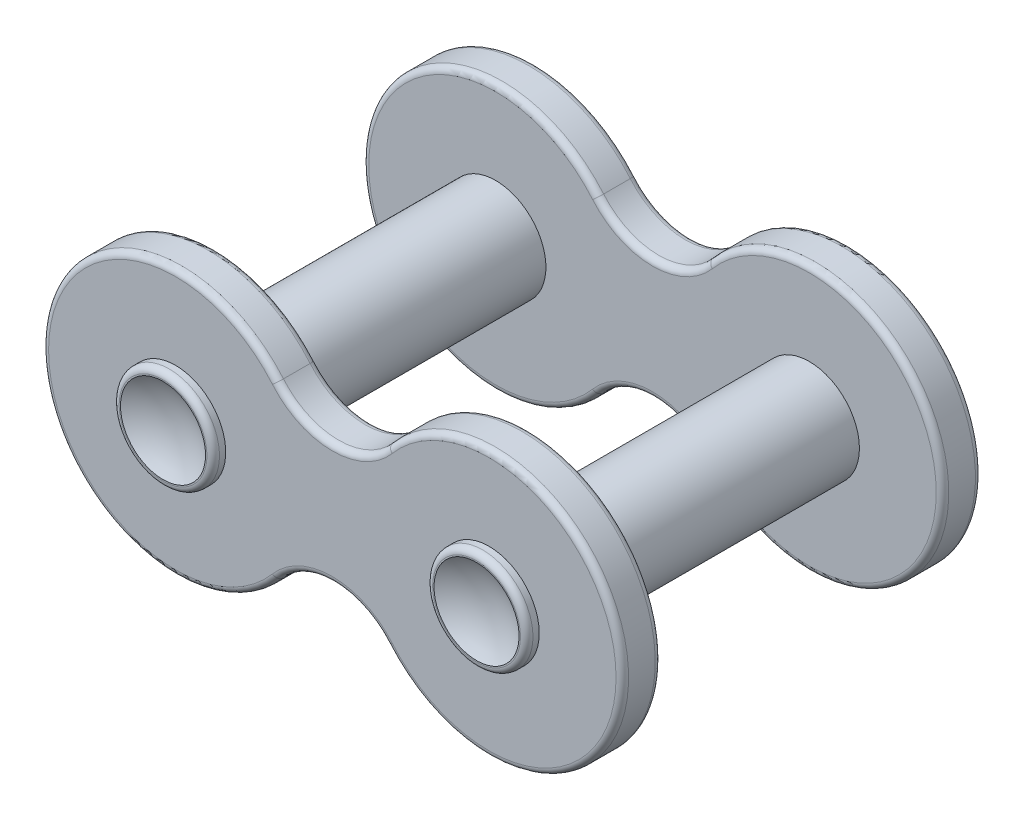
ISO-10303-21;
HEADER;
FILE_DESCRIPTION(('STEP AP214'),'2;1');
FILE_NAME('part.step','',(''),(''),'','','');
FILE_SCHEMA(('AUTOMOTIVE_DESIGN { 1 0 10303 214 1 1 1 1 }'));
ENDSEC;
DATA;
#1=APPLICATION_CONTEXT('core data for automotive mechanical design processes');
#2=APPLICATION_PROTOCOL_DEFINITION('international standard','automotive_design',2000,#1);
#3=PRODUCT_CONTEXT('',#1,'mechanical');
#4=PRODUCT('Part','Part','',(#3));
#5=PRODUCT_RELATED_PRODUCT_CATEGORY('part','',(#4));
#6=PRODUCT_DEFINITION_FORMATION('','',#4);
#7=PRODUCT_DEFINITION_CONTEXT('part definition',#1,'design');
#8=PRODUCT_DEFINITION('design','',#6,#7);
#9=PRODUCT_DEFINITION_SHAPE('','',#8);
#10=(LENGTH_UNIT() NAMED_UNIT(*) SI_UNIT(.MILLI.,.METRE.));
#11=(NAMED_UNIT(*) PLANE_ANGLE_UNIT() SI_UNIT($,.RADIAN.));
#12=(NAMED_UNIT(*) SI_UNIT($,.STERADIAN.) SOLID_ANGLE_UNIT());
#13=UNCERTAINTY_MEASURE_WITH_UNIT(LENGTH_MEASURE(1.E-05),#10,'distance_accuracy_value','');
#14=(GEOMETRIC_REPRESENTATION_CONTEXT(3) GLOBAL_UNCERTAINTY_ASSIGNED_CONTEXT((#13)) GLOBAL_UNIT_ASSIGNED_CONTEXT((#10,
#11,#12)) REPRESENTATION_CONTEXT('',''));
#15=CARTESIAN_POINT('',(0.,0.,0.));
#16=DIRECTION('',(0.,0.,1.));
#17=DIRECTION('',(1.,0.,0.));
#18=AXIS2_PLACEMENT_3D('',#15,#16,#17);
#19=CARTESIAN_POINT('',(2.0833335,1.76532114143129,1.04166667));
#20=DIRECTION('',(0.,0.,1.));
#21=DIRECTION('',(1.,0.,0.));
#22=AXIS2_PLACEMENT_3D('',#19,#20,#21);
#23=PLANE('',#22);
#24=CARTESIAN_POINT('',(-4.166667,0.,1.04166667));
#25=DIRECTION('',(0.,0.,1.));
#26=DIRECTION('',(1.,0.,0.));
#27=AXIS2_PLACEMENT_3D('',#24,#25,#26);
#28=CIRCLE('',#27,3.37499983333333);
#29=CARTESIAN_POINT('',(-1.59176297349593,2.18185543272077,1.04166667));
#30=VERTEX_POINT('',#29);
#31=CARTESIAN_POINT('',(-1.59176297349592,-2.18185543272078,1.04166667));
#32=VERTEX_POINT('',#31);
#33=EDGE_CURVE('E176',#30,#32,#28,.T.);
#34=ORIENTED_EDGE('',*,*,#33,.T.);
#35=CARTESIAN_POINT('',(0.,-3.53064228286257,1.04166667));
#36=DIRECTION('',(0.,0.,1.));
#37=DIRECTION('',(1.,0.,0.));
#38=AXIS2_PLACEMENT_3D('',#35,#36,#37);
#39=CIRCLE('',#38,2.08636893451471);
#40=CARTESIAN_POINT('',(1.59176297349593,-2.18185543272077,1.04166667));
#41=VERTEX_POINT('',#40);
#42=EDGE_CURVE('E158',#32,#41,#39,.F.);
#43=ORIENTED_EDGE('',*,*,#42,.T.);
#44=CARTESIAN_POINT('',(4.166667,0.,1.04166667));
#45=DIRECTION('',(0.,0.,1.));
#46=DIRECTION('',(1.,0.,0.));
#47=AXIS2_PLACEMENT_3D('',#44,#45,#46);
#48=CIRCLE('',#47,3.37499983333333);
#49=CARTESIAN_POINT('',(1.59176297349593,2.18185543272077,1.04166667));
#50=VERTEX_POINT('',#49);
#51=EDGE_CURVE('E170',#41,#50,#48,.T.);
#52=ORIENTED_EDGE('',*,*,#51,.T.);
#53=CARTESIAN_POINT('',(0.,3.53064228286257,1.04166667));
#54=DIRECTION('',(0.,0.,1.));
#55=DIRECTION('',(1.,0.,0.));
#56=AXIS2_PLACEMENT_3D('',#53,#54,#55);
#57=CIRCLE('',#56,2.08636893451471);
#58=EDGE_CURVE('E175',#50,#30,#57,.F.);
#59=ORIENTED_EDGE('',*,*,#58,.T.);
#60=EDGE_LOOP('',(#34,#43,#52,#59));
#61=FACE_BOUND('',#60,.T.);
#62=CARTESIAN_POINT('',(4.166667,0.,1.04166667));
#63=DIRECTION('',(0.,0.,1.));
#64=DIRECTION('',(1.,0.,0.));
#65=AXIS2_PLACEMENT_3D('',#62,#63,#64);
#66=CIRCLE('',#65,1.333335);
#67=CARTESIAN_POINT('',(5.500002,0.,1.04166667));
#68=VERTEX_POINT('',#67);
#69=EDGE_CURVE('E304',#68,#68,#66,.T.);
#70=ORIENTED_EDGE('',*,*,#69,.F.);
#71=EDGE_LOOP('',(#70));
#72=FACE_BOUND('',#71,.T.);
#73=CARTESIAN_POINT('',(-4.166667,0.,1.04166667));
#74=DIRECTION('',(0.,0.,1.));
#75=DIRECTION('',(-1.,0.,0.));
#76=AXIS2_PLACEMENT_3D('',#73,#74,#75);
#77=CIRCLE('',#76,1.333335);
#78=CARTESIAN_POINT('',(-5.500002,0.,1.04166667));
#79=VERTEX_POINT('',#78);
#80=EDGE_CURVE('E296',#79,#79,#77,.T.);
#81=ORIENTED_EDGE('',*,*,#80,.F.);
#82=EDGE_LOOP('',(#81));
#83=FACE_BOUND('',#82,.T.);
#84=ADVANCED_FACE('F39',(#61,#72,#83),#23,.T.);
#85=CARTESIAN_POINT('',(2.0833335,1.76532114143129,0.));
#86=DIRECTION('',(0.,0.,1.));
#87=DIRECTION('',(1.,0.,0.));
#88=AXIS2_PLACEMENT_3D('',#85,#86,#87);
#89=PLANE('',#88);
#90=CARTESIAN_POINT('',(4.166667,0.,0.));
#91=DIRECTION('',(0.,0.,1.));
#92=DIRECTION('',(1.,0.,0.));
#93=AXIS2_PLACEMENT_3D('',#90,#91,#92);
#94=CIRCLE('',#93,3.37499983333333);
#95=CARTESIAN_POINT('',(1.59176297349593,2.18185543272077,0.));
#96=VERTEX_POINT('',#95);
#97=CARTESIAN_POINT('',(1.59176297349593,-2.18185543272077,0.));
#98=VERTEX_POINT('',#97);
#99=EDGE_CURVE('E198',#96,#98,#94,.F.);
#100=ORIENTED_EDGE('',*,*,#99,.T.);
#101=CARTESIAN_POINT('',(0.,-3.53064228286257,0.));
#102=DIRECTION('',(0.,0.,1.));
#103=DIRECTION('',(1.,0.,0.));
#104=AXIS2_PLACEMENT_3D('',#101,#102,#103);
#105=CIRCLE('',#104,2.08636893451471);
#106=CARTESIAN_POINT('',(-1.59176297349592,-2.18185543272078,0.));
#107=VERTEX_POINT('',#106);
#108=EDGE_CURVE('E205',#98,#107,#105,.T.);
#109=ORIENTED_EDGE('',*,*,#108,.T.);
#110=CARTESIAN_POINT('',(-4.166667,0.,0.));
#111=DIRECTION('',(0.,0.,1.));
#112=DIRECTION('',(1.,0.,0.));
#113=AXIS2_PLACEMENT_3D('',#110,#111,#112);
#114=CIRCLE('',#113,3.37499983333333);
#115=CARTESIAN_POINT('',(-1.59176297349593,2.18185543272077,0.));
#116=VERTEX_POINT('',#115);
#117=EDGE_CURVE('E199',#107,#116,#114,.F.);
#118=ORIENTED_EDGE('',*,*,#117,.T.);
#119=CARTESIAN_POINT('',(0.,3.53064228286257,0.));
#120=DIRECTION('',(0.,0.,1.));
#121=DIRECTION('',(1.,0.,0.));
#122=AXIS2_PLACEMENT_3D('',#119,#120,#121);
#123=CIRCLE('',#122,2.08636893451471);
#124=EDGE_CURVE('E196',#116,#96,#123,.T.);
#125=ORIENTED_EDGE('',*,*,#124,.T.);
#126=EDGE_LOOP('',(#100,#109,#118,#125));
#127=FACE_BOUND('',#126,.T.);
#128=CARTESIAN_POINT('',(4.166667,0.,0.));
#129=DIRECTION('',(0.,0.,1.));
#130=DIRECTION('',(1.,0.,0.));
#131=AXIS2_PLACEMENT_3D('',#128,#129,#130);
#132=CIRCLE('',#131,1.333335);
#133=CARTESIAN_POINT('',(5.500002,0.,0.));
#134=VERTEX_POINT('',#133);
#135=EDGE_CURVE('E327',#134,#134,#132,.T.);
#136=ORIENTED_EDGE('',*,*,#135,.T.);
#137=EDGE_LOOP('',(#136));
#138=FACE_BOUND('',#137,.T.);
#139=CARTESIAN_POINT('',(-4.166667,0.,0.));
#140=DIRECTION('',(0.,0.,1.));
#141=DIRECTION('',(1.,0.,0.));
#142=AXIS2_PLACEMENT_3D('',#139,#140,#141);
#143=CIRCLE('',#142,1.333335);
#144=CARTESIAN_POINT('',(-2.833332,0.,0.));
#145=VERTEX_POINT('',#144);
#146=EDGE_CURVE('E291',#145,#145,#143,.F.);
#147=ORIENTED_EDGE('',*,*,#146,.F.);
#148=EDGE_LOOP('',(#147));
#149=FACE_BOUND('',#148,.T.);
#150=ADVANCED_FACE('F397',(#127,#138,#149),#89,.F.);
#151=CARTESIAN_POINT('',(0.,3.53064228286257,1.04166667));
#152=DIRECTION('',(0.,0.,-1.));
#153=DIRECTION('',(-1.,0.,0.));
#154=AXIS2_PLACEMENT_3D('',#151,#152,#153);
#155=CYLINDRICAL_SURFACE('',#154,1.91970226784804);
#156=DIRECTION('',(0.,0.,-1.));
#157=VECTOR('',#156,1.);
#158=CARTESIAN_POINT('',(-1.46460721282138,2.2896013853364,1.04166667));
#159=LINE('',#158,#157);
#160=CARTESIAN_POINT('',(-1.46460721282138,2.2896013853364,0.875000003333333));
#161=VERTEX_POINT('',#160);
#162=CARTESIAN_POINT('',(-1.46460721282138,2.2896013853364,0.166666666666667));
#163=VERTEX_POINT('',#162);
#164=EDGE_CURVE('E320',#161,#163,#159,.T.);
#165=ORIENTED_EDGE('',*,*,#164,.F.);
#166=CARTESIAN_POINT('',(0.,3.53064228286257,0.875000003333333));
#167=DIRECTION('',(0.,0.,1.));
#168=DIRECTION('',(1.,0.,0.));
#169=AXIS2_PLACEMENT_3D('',#166,#167,#168);
#170=CIRCLE('',#169,1.91970226784804);
#171=CARTESIAN_POINT('',(1.46460721282137,2.28960138533641,0.875000003333333));
#172=VERTEX_POINT('',#171);
#173=EDGE_CURVE('E192',#161,#172,#170,.T.);
#174=ORIENTED_EDGE('',*,*,#173,.T.);
#175=DIRECTION('',(0.,0.,-1.));
#176=VECTOR('',#175,1.);
#177=CARTESIAN_POINT('',(1.46460721282137,2.28960138533641,1.04166667));
#178=LINE('',#177,#176);
#179=CARTESIAN_POINT('',(1.46460721282137,2.28960138533641,0.166666666666667));
#180=VERTEX_POINT('',#179);
#181=EDGE_CURVE('E306',#172,#180,#178,.T.);
#182=ORIENTED_EDGE('',*,*,#181,.T.);
#183=CARTESIAN_POINT('',(0.,3.53064228286257,0.166666666666667));
#184=DIRECTION('',(0.,0.,1.));
#185=DIRECTION('',(1.,0.,0.));
#186=AXIS2_PLACEMENT_3D('',#183,#184,#185);
#187=CIRCLE('',#186,1.91970226784804);
#188=EDGE_CURVE('E195',#180,#163,#187,.F.);
#189=ORIENTED_EDGE('',*,*,#188,.T.);
#190=EDGE_LOOP('',(#165,#174,#182,#189));
#191=FACE_BOUND('',#190,.T.);
#192=ADVANCED_FACE('F388',(#191),#155,.F.);
#193=CARTESIAN_POINT('',(-4.166667,0.,1.04166667));
#194=DIRECTION('',(0.,0.,-1.));
#195=DIRECTION('',(-1.,0.,0.));
#196=AXIS2_PLACEMENT_3D('',#193,#194,#195);
#197=CYLINDRICAL_SURFACE('',#196,3.5416665);
#198=DIRECTION('',(0.,0.,-1.));
#199=VECTOR('',#198,1.);
#200=CARTESIAN_POINT('',(-1.46460721282136,-2.28960138533642,1.04166667));
#201=LINE('',#200,#199);
#202=CARTESIAN_POINT('',(-1.46460721282136,-2.28960138533642,0.875000003333333));
#203=VERTEX_POINT('',#202);
#204=CARTESIAN_POINT('',(-1.46460721282136,-2.28960138533642,0.166666666666667));
#205=VERTEX_POINT('',#204);
#206=EDGE_CURVE('E314',#203,#205,#201,.T.);
#207=ORIENTED_EDGE('',*,*,#206,.F.);
#208=CARTESIAN_POINT('',(-4.166667,0.,0.875000003333333));
#209=DIRECTION('',(0.,0.,1.));
#210=DIRECTION('',(1.,0.,0.));
#211=AXIS2_PLACEMENT_3D('',#208,#209,#210);
#212=CIRCLE('',#211,3.5416665);
#213=EDGE_CURVE('E187',#203,#161,#212,.F.);
#214=ORIENTED_EDGE('',*,*,#213,.T.);
#215=ORIENTED_EDGE('',*,*,#164,.T.);
#216=CARTESIAN_POINT('',(-4.166667,0.,0.166666666666667));
#217=DIRECTION('',(0.,0.,1.));
#218=DIRECTION('',(1.,0.,0.));
#219=AXIS2_PLACEMENT_3D('',#216,#217,#218);
#220=CIRCLE('',#219,3.5416665);
#221=EDGE_CURVE('E190',#163,#205,#220,.T.);
#222=ORIENTED_EDGE('',*,*,#221,.T.);
#223=EDGE_LOOP('',(#207,#214,#215,#222));
#224=FACE_BOUND('',#223,.T.);
#225=ADVANCED_FACE('F373',(#224),#197,.T.);
#226=CARTESIAN_POINT('',(0.,-3.53064228286257,1.04166667));
#227=DIRECTION('',(0.,0.,-1.));
#228=DIRECTION('',(-1.,0.,0.));
#229=AXIS2_PLACEMENT_3D('',#226,#227,#228);
#230=CYLINDRICAL_SURFACE('',#229,1.91970226784804);
#231=DIRECTION('',(0.,0.,-1.));
#232=VECTOR('',#231,1.);
#233=CARTESIAN_POINT('',(1.46460721282137,-2.28960138533641,1.04166667));
#234=LINE('',#233,#232);
#235=CARTESIAN_POINT('',(1.46460721282137,-2.28960138533641,0.875000003333333));
#236=VERTEX_POINT('',#235);
#237=CARTESIAN_POINT('',(1.46460721282137,-2.28960138533641,0.166666666666667));
#238=VERTEX_POINT('',#237);
#239=EDGE_CURVE('E313',#236,#238,#234,.T.);
#240=ORIENTED_EDGE('',*,*,#239,.F.);
#241=CARTESIAN_POINT('',(0.,-3.53064228286257,0.875000003333333));
#242=DIRECTION('',(0.,0.,1.));
#243=DIRECTION('',(1.,0.,0.));
#244=AXIS2_PLACEMENT_3D('',#241,#242,#243);
#245=CIRCLE('',#244,1.91970226784804);
#246=EDGE_CURVE('E159',#236,#203,#245,.T.);
#247=ORIENTED_EDGE('',*,*,#246,.T.);
#248=ORIENTED_EDGE('',*,*,#206,.T.);
#249=CARTESIAN_POINT('',(0.,-3.53064228286257,0.166666666666667));
#250=DIRECTION('',(0.,0.,1.));
#251=DIRECTION('',(1.,0.,0.));
#252=AXIS2_PLACEMENT_3D('',#249,#250,#251);
#253=CIRCLE('',#252,1.91970226784804);
#254=EDGE_CURVE('E179',#205,#238,#253,.F.);
#255=ORIENTED_EDGE('',*,*,#254,.T.);
#256=EDGE_LOOP('',(#240,#247,#248,#255));
#257=FACE_BOUND('',#256,.T.);
#258=ADVANCED_FACE('F371',(#257),#230,.F.);
#259=CARTESIAN_POINT('',(4.166667,0.,1.04166667));
#260=DIRECTION('',(0.,0.,-1.));
#261=DIRECTION('',(-1.,0.,0.));
#262=AXIS2_PLACEMENT_3D('',#259,#260,#261);
#263=CYLINDRICAL_SURFACE('',#262,3.5416665);
#264=ORIENTED_EDGE('',*,*,#181,.F.);
#265=CARTESIAN_POINT('',(4.166667,0.,0.875000003333333));
#266=DIRECTION('',(0.,0.,1.));
#267=DIRECTION('',(1.,0.,0.));
#268=AXIS2_PLACEMENT_3D('',#265,#266,#267);
#269=CIRCLE('',#268,3.5416665);
#270=EDGE_CURVE('E237',#172,#236,#269,.F.);
#271=ORIENTED_EDGE('',*,*,#270,.T.);
#272=ORIENTED_EDGE('',*,*,#239,.T.);
#273=CARTESIAN_POINT('',(4.166667,0.,0.166666666666667));
#274=DIRECTION('',(0.,0.,1.));
#275=DIRECTION('',(1.,0.,0.));
#276=AXIS2_PLACEMENT_3D('',#273,#274,#275);
#277=CIRCLE('',#276,3.5416665);
#278=EDGE_CURVE('E232',#238,#180,#277,.T.);
#279=ORIENTED_EDGE('',*,*,#278,.T.);
#280=EDGE_LOOP('',(#264,#271,#272,#279));
#281=FACE_BOUND('',#280,.T.);
#282=ADVANCED_FACE('F390',(#281),#263,.T.);
#283=CARTESIAN_POINT('',(-4.166667,0.,-0.33333333));
#284=DIRECTION('',(0.,0.,-1.));
#285=DIRECTION('',(-1.,0.,0.));
#286=AXIS2_PLACEMENT_3D('',#283,#284,#285);
#287=PLANE('',#286);
#288=CARTESIAN_POINT('',(-4.166667,0.,-0.33333333));
#289=DIRECTION('',(0.,0.,-1.));
#290=DIRECTION('',(-1.,0.,0.));
#291=AXIS2_PLACEMENT_3D('',#288,#289,#290);
#292=CIRCLE('',#291,1.16666833333334);
#293=CARTESIAN_POINT('',(-5.33333533333334,0.,-0.33333333));
#294=VERTEX_POINT('',#293);
#295=EDGE_CURVE('E323',#294,#294,#292,.T.);
#296=ORIENTED_EDGE('',*,*,#295,.T.);
#297=EDGE_LOOP('',(#296));
#298=FACE_BOUND('',#297,.T.);
#299=CARTESIAN_POINT('',(-4.166667,0.,-0.33333333));
#300=DIRECTION('',(0.,0.,-1.));
#301=DIRECTION('',(-1.,0.,0.));
#302=AXIS2_PLACEMENT_3D('',#299,#300,#301);
#303=CIRCLE('',#302,1.13038822706577);
#304=CARTESIAN_POINT('',(-5.29705522706577,0.,-0.33333333));
#305=VERTEX_POINT('',#304);
#306=EDGE_CURVE('E334',#305,#305,#303,.T.);
#307=ORIENTED_EDGE('',*,*,#306,.F.);
#308=EDGE_LOOP('',(#307));
#309=FACE_BOUND('',#308,.T.);
#310=ADVANCED_FACE('F413',(#298,#309),#287,.T.);
#311=CARTESIAN_POINT('',(-4.166667,0.,-0.33333333));
#312=DIRECTION('',(0.,0.,1.));
#313=DIRECTION('',(1.,0.,0.));
#314=AXIS2_PLACEMENT_3D('',#311,#312,#313);
#315=CYLINDRICAL_SURFACE('',#314,1.333335);
#316=CARTESIAN_POINT('',(-4.166667,0.,-0.166666663333333));
#317=DIRECTION('',(0.,0.,-1.));
#318=DIRECTION('',(-1.,0.,0.));
#319=AXIS2_PLACEMENT_3D('',#316,#317,#318);
#320=CIRCLE('',#319,1.333335);
#321=CARTESIAN_POINT('',(-5.500002,0.,-0.166666663333333));
#322=VERTEX_POINT('',#321);
#323=EDGE_CURVE('E337',#322,#322,#320,.F.);
#324=ORIENTED_EDGE('',*,*,#323,.T.);
#325=EDGE_LOOP('',(#324));
#326=FACE_BOUND('',#325,.T.);
#327=ORIENTED_EDGE('',*,*,#146,.T.);
#328=EDGE_LOOP('',(#327));
#329=FACE_BOUND('',#328,.T.);
#330=ADVANCED_FACE('F410',(#326,#329),#315,.T.);
#331=CARTESIAN_POINT('',(-4.166667,0.,8.51033333));
#332=DIRECTION('',(0.,0.,1.));
#333=DIRECTION('',(-1.,0.,0.));
#334=AXIS2_PLACEMENT_3D('',#331,#332,#333);
#335=CIRCLE('',#334,1.333335);
#336=CARTESIAN_POINT('',(-5.500002,0.,8.51033333));
#337=VERTEX_POINT('',#336);
#338=EDGE_CURVE('E330',#337,#337,#335,.T.);
#339=ORIENTED_EDGE('',*,*,#338,.F.);
#340=EDGE_LOOP('',(#339));
#341=FACE_BOUND('',#340,.T.);
#342=ORIENTED_EDGE('',*,*,#80,.T.);
#343=EDGE_LOOP('',(#342));
#344=FACE_BOUND('',#343,.T.);
#345=ADVANCED_FACE('F407',(#341,#344),#315,.T.);
#346=CARTESIAN_POINT('',(0.,3.53064228286257,8.51033333));
#347=DIRECTION('',(0.,0.,1.));
#348=DIRECTION('',(1.,0.,0.));
#349=AXIS2_PLACEMENT_3D('',#346,#347,#348);
#350=CYLINDRICAL_SURFACE('',#349,1.91970226784804);
#351=DIRECTION('',(0.,0.,1.));
#352=VECTOR('',#351,1.);
#353=CARTESIAN_POINT('',(1.46460721282137,2.28960138533641,8.51033333));
#354=LINE('',#353,#352);
#355=CARTESIAN_POINT('',(1.46460721282137,2.28960138533641,8.67699999666667));
#356=VERTEX_POINT('',#355);
#357=CARTESIAN_POINT('',(1.46460721282137,2.28960138533641,9.38533333333333));
#358=VERTEX_POINT('',#357);
#359=EDGE_CURVE('E283',#356,#358,#354,.T.);
#360=ORIENTED_EDGE('',*,*,#359,.F.);
#361=CARTESIAN_POINT('',(0.,3.53064228286257,8.67699999666667));
#362=DIRECTION('',(0.,0.,-1.));
#363=DIRECTION('',(-1.,0.,0.));
#364=AXIS2_PLACEMENT_3D('',#361,#362,#363);
#365=CIRCLE('',#364,1.91970226784804);
#366=CARTESIAN_POINT('',(-1.46460721282138,2.2896013853364,8.67699999666667));
#367=VERTEX_POINT('',#366);
#368=EDGE_CURVE('E229',#356,#367,#365,.T.);
#369=ORIENTED_EDGE('',*,*,#368,.T.);
#370=DIRECTION('',(0.,0.,1.));
#371=VECTOR('',#370,1.);
#372=CARTESIAN_POINT('',(-1.46460721282138,2.2896013853364,8.51033333));
#373=LINE('',#372,#371);
#374=CARTESIAN_POINT('',(-1.46460721282138,2.2896013853364,9.38533333333333));
#375=VERTEX_POINT('',#374);
#376=EDGE_CURVE('E290',#367,#375,#373,.T.);
#377=ORIENTED_EDGE('',*,*,#376,.T.);
#378=CARTESIAN_POINT('',(0.,3.53064228286257,9.38533333333333));
#379=DIRECTION('',(0.,0.,-1.));
#380=DIRECTION('',(-1.,0.,0.));
#381=AXIS2_PLACEMENT_3D('',#378,#379,#380);
#382=CIRCLE('',#381,1.91970226784804);
#383=EDGE_CURVE('E221',#375,#358,#382,.F.);
#384=ORIENTED_EDGE('',*,*,#383,.T.);
#385=EDGE_LOOP('',(#360,#369,#377,#384));
#386=FACE_BOUND('',#385,.T.);
#387=ADVANCED_FACE('F285',(#386),#350,.F.);
#388=CARTESIAN_POINT('',(4.166667,0.,8.51033333));
#389=DIRECTION('',(0.,0.,1.));
#390=DIRECTION('',(1.,0.,0.));
#391=AXIS2_PLACEMENT_3D('',#388,#389,#390);
#392=CYLINDRICAL_SURFACE('',#391,3.5416665);
#393=DIRECTION('',(0.,0.,1.));
#394=VECTOR('',#393,1.);
#395=CARTESIAN_POINT('',(1.46460721282137,-2.28960138533641,8.51033333));
#396=LINE('',#395,#394);
#397=CARTESIAN_POINT('',(1.46460721282137,-2.28960138533641,8.67699999666667));
#398=VERTEX_POINT('',#397);
#399=CARTESIAN_POINT('',(1.46460721282137,-2.28960138533641,9.38533333333333));
#400=VERTEX_POINT('',#399);
#401=EDGE_CURVE('E294',#398,#400,#396,.T.);
#402=ORIENTED_EDGE('',*,*,#401,.F.);
#403=CARTESIAN_POINT('',(4.166667,0.,8.67699999666667));
#404=DIRECTION('',(0.,0.,-1.));
#405=DIRECTION('',(-1.,0.,0.));
#406=AXIS2_PLACEMENT_3D('',#403,#404,#405);
#407=CIRCLE('',#406,3.5416665);
#408=EDGE_CURVE('E11',#398,#356,#407,.F.);
#409=ORIENTED_EDGE('',*,*,#408,.T.);
#410=ORIENTED_EDGE('',*,*,#359,.T.);
#411=CARTESIAN_POINT('',(4.166667,0.,9.38533333333333));
#412=DIRECTION('',(0.,0.,-1.));
#413=DIRECTION('',(-1.,0.,0.));
#414=AXIS2_PLACEMENT_3D('',#411,#412,#413);
#415=CIRCLE('',#414,3.5416665);
#416=EDGE_CURVE('E48',#358,#400,#415,.T.);
#417=ORIENTED_EDGE('',*,*,#416,.T.);
#418=EDGE_LOOP('',(#402,#409,#410,#417));
#419=FACE_BOUND('',#418,.T.);
#420=ADVANCED_FACE('F289',(#419),#392,.T.);
#421=CARTESIAN_POINT('',(0.,-3.53064228286257,8.51033333));
#422=DIRECTION('',(0.,0.,1.));
#423=DIRECTION('',(1.,0.,0.));
#424=AXIS2_PLACEMENT_3D('',#421,#422,#423);
#425=CYLINDRICAL_SURFACE('',#424,1.91970226784804);
#426=DIRECTION('',(0.,0.,1.));
#427=VECTOR('',#426,1.);
#428=CARTESIAN_POINT('',(-1.46460721282136,-2.28960138533642,8.51033333));
#429=LINE('',#428,#427);
#430=CARTESIAN_POINT('',(-1.46460721282136,-2.28960138533642,8.67699999666667));
#431=VERTEX_POINT('',#430);
#432=CARTESIAN_POINT('',(-1.46460721282136,-2.28960138533642,9.38533333333333));
#433=VERTEX_POINT('',#432);
#434=EDGE_CURVE('E298',#431,#433,#429,.T.);
#435=ORIENTED_EDGE('',*,*,#434,.F.);
#436=CARTESIAN_POINT('',(0.,-3.53064228286257,8.67699999666667));
#437=DIRECTION('',(0.,0.,-1.));
#438=DIRECTION('',(-1.,0.,0.));
#439=AXIS2_PLACEMENT_3D('',#436,#437,#438);
#440=CIRCLE('',#439,1.91970226784804);
#441=EDGE_CURVE('E208',#431,#398,#440,.T.);
#442=ORIENTED_EDGE('',*,*,#441,.T.);
#443=ORIENTED_EDGE('',*,*,#401,.T.);
#444=CARTESIAN_POINT('',(0.,-3.53064228286257,9.38533333333333));
#445=DIRECTION('',(0.,0.,-1.));
#446=DIRECTION('',(-1.,0.,0.));
#447=AXIS2_PLACEMENT_3D('',#444,#445,#446);
#448=CIRCLE('',#447,1.91970226784804);
#449=EDGE_CURVE('E202',#400,#433,#448,.F.);
#450=ORIENTED_EDGE('',*,*,#449,.T.);
#451=EDGE_LOOP('',(#435,#442,#443,#450));
#452=FACE_BOUND('',#451,.T.);
#453=ADVANCED_FACE('F586',(#452),#425,.F.);
#454=CARTESIAN_POINT('',(-4.166667,0.,8.51033333));
#455=DIRECTION('',(0.,0.,1.));
#456=DIRECTION('',(1.,0.,0.));
#457=AXIS2_PLACEMENT_3D('',#454,#455,#456);
#458=CYLINDRICAL_SURFACE('',#457,3.5416665);
#459=ORIENTED_EDGE('',*,*,#376,.F.);
#460=CARTESIAN_POINT('',(-4.166667,0.,8.67699999666667));
#461=DIRECTION('',(0.,0.,-1.));
#462=DIRECTION('',(-1.,0.,0.));
#463=AXIS2_PLACEMENT_3D('',#460,#461,#462);
#464=CIRCLE('',#463,3.5416665);
#465=EDGE_CURVE('E225',#367,#431,#464,.F.);
#466=ORIENTED_EDGE('',*,*,#465,.T.);
#467=ORIENTED_EDGE('',*,*,#434,.T.);
#468=CARTESIAN_POINT('',(-4.166667,0.,9.38533333333333));
#469=DIRECTION('',(0.,0.,-1.));
#470=DIRECTION('',(-1.,0.,0.));
#471=AXIS2_PLACEMENT_3D('',#468,#469,#470);
#472=CIRCLE('',#471,3.5416665);
#473=EDGE_CURVE('E219',#433,#375,#472,.T.);
#474=ORIENTED_EDGE('',*,*,#473,.T.);
#475=EDGE_LOOP('',(#459,#466,#467,#474));
#476=FACE_BOUND('',#475,.T.);
#477=ADVANCED_FACE('F577',(#476),#458,.T.);
#478=CARTESIAN_POINT('',(2.0833335,1.76532114143129,8.51033333));
#479=DIRECTION('',(0.,0.,-1.));
#480=DIRECTION('',(1.,0.,0.));
#481=AXIS2_PLACEMENT_3D('',#478,#479,#480);
#482=PLANE('',#481);
#483=CARTESIAN_POINT('',(4.166667,0.,8.51033333));
#484=DIRECTION('',(0.,0.,-1.));
#485=DIRECTION('',(-1.,0.,0.));
#486=AXIS2_PLACEMENT_3D('',#483,#484,#485);
#487=CIRCLE('',#486,3.37499983333333);
#488=CARTESIAN_POINT('',(1.59176297349593,2.18185543272077,8.51033333));
#489=VERTEX_POINT('',#488);
#490=CARTESIAN_POINT('',(1.59176297349593,-2.18185543272077,8.51033333));
#491=VERTEX_POINT('',#490);
#492=EDGE_CURVE('E211',#489,#491,#487,.T.);
#493=ORIENTED_EDGE('',*,*,#492,.T.);
#494=CARTESIAN_POINT('',(0.,-3.53064228286257,8.51033333));
#495=DIRECTION('',(0.,0.,-1.));
#496=DIRECTION('',(-1.,0.,0.));
#497=AXIS2_PLACEMENT_3D('',#494,#495,#496);
#498=CIRCLE('',#497,2.08636893451471);
#499=CARTESIAN_POINT('',(-1.59176297349592,-2.18185543272078,8.51033333));
#500=VERTEX_POINT('',#499);
#501=EDGE_CURVE('E220',#491,#500,#498,.F.);
#502=ORIENTED_EDGE('',*,*,#501,.T.);
#503=CARTESIAN_POINT('',(-4.166667,0.,8.51033333));
#504=DIRECTION('',(0.,0.,-1.));
#505=DIRECTION('',(-1.,0.,0.));
#506=AXIS2_PLACEMENT_3D('',#503,#504,#505);
#507=CIRCLE('',#506,3.37499983333333);
#508=CARTESIAN_POINT('',(-1.59176297349593,2.18185543272077,8.51033333));
#509=VERTEX_POINT('',#508);
#510=EDGE_CURVE('E214',#500,#509,#507,.T.);
#511=ORIENTED_EDGE('',*,*,#510,.T.);
#512=CARTESIAN_POINT('',(0.,3.53064228286257,8.51033333));
#513=DIRECTION('',(0.,0.,-1.));
#514=DIRECTION('',(-1.,0.,0.));
#515=AXIS2_PLACEMENT_3D('',#512,#513,#514);
#516=CIRCLE('',#515,2.08636893451471);
#517=EDGE_CURVE('E213',#509,#489,#516,.F.);
#518=ORIENTED_EDGE('',*,*,#517,.T.);
#519=EDGE_LOOP('',(#493,#502,#511,#518));
#520=FACE_BOUND('',#519,.T.);
#521=ORIENTED_EDGE('',*,*,#338,.T.);
#522=EDGE_LOOP('',(#521));
#523=FACE_BOUND('',#522,.T.);
#524=CARTESIAN_POINT('',(4.166667,0.,8.51033333));
#525=DIRECTION('',(0.,0.,-1.));
#526=DIRECTION('',(-1.,0.,0.));
#527=AXIS2_PLACEMENT_3D('',#524,#525,#526);
#528=CIRCLE('',#527,1.333335);
#529=CARTESIAN_POINT('',(2.833332,0.,8.51033333));
#530=VERTEX_POINT('',#529);
#531=EDGE_CURVE('E335',#530,#530,#528,.T.);
#532=ORIENTED_EDGE('',*,*,#531,.F.);
#533=EDGE_LOOP('',(#532));
#534=FACE_BOUND('',#533,.T.);
#535=ADVANCED_FACE('F568',(#520,#523,#534),#482,.T.);
#536=CARTESIAN_POINT('',(2.0833335,1.76532114143129,9.552));
#537=DIRECTION('',(0.,0.,-1.));
#538=DIRECTION('',(1.,0.,0.));
#539=AXIS2_PLACEMENT_3D('',#536,#537,#538);
#540=PLANE('',#539);
#541=CARTESIAN_POINT('',(-4.166667,0.,9.552));
#542=DIRECTION('',(0.,0.,-1.));
#543=DIRECTION('',(-1.,0.,0.));
#544=AXIS2_PLACEMENT_3D('',#541,#542,#543);
#545=CIRCLE('',#544,3.37499983333333);
#546=CARTESIAN_POINT('',(-1.59176297349593,2.18185543272077,9.552));
#547=VERTEX_POINT('',#546);
#548=CARTESIAN_POINT('',(-1.59176297349592,-2.18185543272078,9.552));
#549=VERTEX_POINT('',#548);
#550=EDGE_CURVE('E57',#547,#549,#545,.F.);
#551=ORIENTED_EDGE('',*,*,#550,.T.);
#552=CARTESIAN_POINT('',(0.,-3.53064228286257,9.552));
#553=DIRECTION('',(0.,0.,-1.));
#554=DIRECTION('',(-1.,0.,0.));
#555=AXIS2_PLACEMENT_3D('',#552,#553,#554);
#556=CIRCLE('',#555,2.08636893451471);
#557=CARTESIAN_POINT('',(1.59176297349593,-2.18185543272077,9.552));
#558=VERTEX_POINT('',#557);
#559=EDGE_CURVE('E235',#549,#558,#556,.T.);
#560=ORIENTED_EDGE('',*,*,#559,.T.);
#561=CARTESIAN_POINT('',(4.166667,0.,9.552));
#562=DIRECTION('',(0.,0.,-1.));
#563=DIRECTION('',(-1.,0.,0.));
#564=AXIS2_PLACEMENT_3D('',#561,#562,#563);
#565=CIRCLE('',#564,3.37499983333333);
#566=CARTESIAN_POINT('',(1.59176297349593,2.18185543272077,9.552));
#567=VERTEX_POINT('',#566);
#568=EDGE_CURVE('E230',#558,#567,#565,.F.);
#569=ORIENTED_EDGE('',*,*,#568,.T.);
#570=CARTESIAN_POINT('',(0.,3.53064228286257,9.552));
#571=DIRECTION('',(0.,0.,-1.));
#572=DIRECTION('',(-1.,0.,0.));
#573=AXIS2_PLACEMENT_3D('',#570,#571,#572);
#574=CIRCLE('',#573,2.08636893451471);
#575=EDGE_CURVE('E64',#567,#547,#574,.T.);
#576=ORIENTED_EDGE('',*,*,#575,.T.);
#577=EDGE_LOOP('',(#551,#560,#569,#576));
#578=FACE_BOUND('',#577,.T.);
#579=CARTESIAN_POINT('',(-4.166667,0.,9.552));
#580=DIRECTION('',(0.,0.,-1.));
#581=DIRECTION('',(-1.,0.,0.));
#582=AXIS2_PLACEMENT_3D('',#579,#580,#581);
#583=CIRCLE('',#582,1.333335);
#584=CARTESIAN_POINT('',(-5.500002,0.,9.552));
#585=VERTEX_POINT('',#584);
#586=EDGE_CURVE('E319',#585,#585,#583,.T.);
#587=ORIENTED_EDGE('',*,*,#586,.T.);
#588=EDGE_LOOP('',(#587));
#589=FACE_BOUND('',#588,.T.);
#590=CARTESIAN_POINT('',(4.166667,0.,9.552));
#591=DIRECTION('',(0.,0.,1.));
#592=DIRECTION('',(1.,0.,0.));
#593=AXIS2_PLACEMENT_3D('',#590,#591,#592);
#594=CIRCLE('',#593,1.333335);
#595=CARTESIAN_POINT('',(5.500002,0.,9.552));
#596=VERTEX_POINT('',#595);
#597=EDGE_CURVE('E840',#596,#596,#594,.T.);
#598=ORIENTED_EDGE('',*,*,#597,.F.);
#599=EDGE_LOOP('',(#598));
#600=FACE_BOUND('',#599,.T.);
#601=ADVANCED_FACE('F567',(#578,#589,#600),#540,.F.);
#602=CARTESIAN_POINT('',(-4.166667,0.,9.88533333));
#603=DIRECTION('',(0.,0.,-1.));
#604=DIRECTION('',(-1.,0.,0.));
#605=AXIS2_PLACEMENT_3D('',#602,#603,#604);
#606=PLANE('',#605);
#607=CARTESIAN_POINT('',(-4.166667,0.,9.88533333));
#608=DIRECTION('',(0.,0.,-1.));
#609=DIRECTION('',(-1.,0.,0.));
#610=AXIS2_PLACEMENT_3D('',#607,#608,#609);
#611=CIRCLE('',#610,1.16666833333334);
#612=CARTESIAN_POINT('',(-5.33333533333334,0.,9.88533333));
#613=VERTEX_POINT('',#612);
#614=EDGE_CURVE('E173',#613,#613,#611,.F.);
#615=ORIENTED_EDGE('',*,*,#614,.T.);
#616=EDGE_LOOP('',(#615));
#617=FACE_BOUND('',#616,.T.);
#618=CARTESIAN_POINT('',(-4.166667,0.,9.88533333));
#619=DIRECTION('',(0.,0.,-1.));
#620=DIRECTION('',(-1.,0.,0.));
#621=AXIS2_PLACEMENT_3D('',#618,#619,#620);
#622=CIRCLE('',#621,1.13038822706577);
#623=CARTESIAN_POINT('',(-5.29705522706577,0.,9.88533333));
#624=VERTEX_POINT('',#623);
#625=EDGE_CURVE('E322',#624,#624,#622,.T.);
#626=ORIENTED_EDGE('',*,*,#625,.T.);
#627=EDGE_LOOP('',(#626));
#628=FACE_BOUND('',#627,.T.);
#629=ADVANCED_FACE('F426',(#617,#628),#606,.F.);
#630=CARTESIAN_POINT('',(-4.166667,0.,9.71866666333333));
#631=DIRECTION('',(0.,0.,-1.));
#632=DIRECTION('',(-1.,0.,0.));
#633=AXIS2_PLACEMENT_3D('',#630,#631,#632);
#634=CIRCLE('',#633,1.333335);
#635=CARTESIAN_POINT('',(-5.500002,0.,9.71866666333333));
#636=VERTEX_POINT('',#635);
#637=EDGE_CURVE('E352',#636,#636,#634,.T.);
#638=ORIENTED_EDGE('',*,*,#637,.T.);
#639=EDGE_LOOP('',(#638));
#640=FACE_BOUND('',#639,.T.);
#641=ORIENTED_EDGE('',*,*,#586,.F.);
#642=EDGE_LOOP('',(#641));
#643=FACE_BOUND('',#642,.T.);
#644=ADVANCED_FACE('F412',(#640,#643),#315,.T.);
#645=CARTESIAN_POINT('',(-4.166667,0.,11.635333));
#646=DIRECTION('',(0.,0.,-1.));
#647=DIRECTION('',(1.,0.,0.));
#648=AXIS2_PLACEMENT_3D('',#645,#646,#647);
#649=SPHERICAL_SURFACE('',#648,2.083333);
#650=ORIENTED_EDGE('',*,*,#625,.F.);
#651=EDGE_LOOP('',(#650));
#652=FACE_BOUND('',#651,.T.);
#653=ADVANCED_FACE('F422',(#652),#649,.F.);
#654=CARTESIAN_POINT('',(4.166667,0.,9.88533333));
#655=DIRECTION('',(0.,0.,-1.));
#656=DIRECTION('',(1.,0.,0.));
#657=AXIS2_PLACEMENT_3D('',#654,#655,#656);
#658=PLANE('',#657);
#659=CARTESIAN_POINT('',(4.166667,0.,9.88533333));
#660=DIRECTION('',(0.,0.,-1.));
#661=DIRECTION('',(-1.,0.,0.));
#662=AXIS2_PLACEMENT_3D('',#659,#660,#661);
#663=CIRCLE('',#662,1.16666833333334);
#664=CARTESIAN_POINT('',(2.99999866666666,0.,9.88533333));
#665=VERTEX_POINT('',#664);
#666=EDGE_CURVE('E349',#665,#665,#663,.F.);
#667=ORIENTED_EDGE('',*,*,#666,.T.);
#668=EDGE_LOOP('',(#667));
#669=FACE_BOUND('',#668,.T.);
#670=CARTESIAN_POINT('',(4.166667,0.,9.88533333));
#671=DIRECTION('',(0.,0.,-1.));
#672=DIRECTION('',(-1.,0.,0.));
#673=AXIS2_PLACEMENT_3D('',#670,#671,#672);
#674=CIRCLE('',#673,1.13038822706577);
#675=CARTESIAN_POINT('',(3.03627877293423,0.,9.88533333));
#676=VERTEX_POINT('',#675);
#677=EDGE_CURVE('E328',#676,#676,#674,.T.);
#678=ORIENTED_EDGE('',*,*,#677,.T.);
#679=EDGE_LOOP('',(#678));
#680=FACE_BOUND('',#679,.T.);
#681=ADVANCED_FACE('F690',(#669,#680),#658,.F.);
#682=CARTESIAN_POINT('',(4.166667,0.,-0.33333333));
#683=DIRECTION('',(0.,0.,1.));
#684=DIRECTION('',(1.,0.,0.));
#685=AXIS2_PLACEMENT_3D('',#682,#683,#684);
#686=CYLINDRICAL_SURFACE('',#685,1.333335);
#687=CARTESIAN_POINT('',(4.166667,0.,9.71866666333333));
#688=DIRECTION('',(0.,0.,-1.));
#689=DIRECTION('',(-1.,0.,0.));
#690=AXIS2_PLACEMENT_3D('',#687,#688,#689);
#691=CIRCLE('',#690,1.333335);
#692=CARTESIAN_POINT('',(2.833332,0.,9.71866666333333));
#693=VERTEX_POINT('',#692);
#694=EDGE_CURVE('E351',#693,#693,#691,.T.);
#695=ORIENTED_EDGE('',*,*,#694,.T.);
#696=EDGE_LOOP('',(#695));
#697=FACE_BOUND('',#696,.T.);
#698=ORIENTED_EDGE('',*,*,#597,.T.);
#699=EDGE_LOOP('',(#698));
#700=FACE_BOUND('',#699,.T.);
#701=ADVANCED_FACE('F694',(#697,#700),#686,.T.);
#702=ORIENTED_EDGE('',*,*,#69,.T.);
#703=EDGE_LOOP('',(#702));
#704=FACE_BOUND('',#703,.T.);
#705=ORIENTED_EDGE('',*,*,#531,.T.);
#706=EDGE_LOOP('',(#705));
#707=FACE_BOUND('',#706,.T.);
#708=ADVANCED_FACE('F702',(#704,#707),#686,.T.);
#709=CARTESIAN_POINT('',(4.166667,0.,-0.166666663333333));
#710=DIRECTION('',(0.,0.,-1.));
#711=DIRECTION('',(-1.,0.,0.));
#712=AXIS2_PLACEMENT_3D('',#709,#710,#711);
#713=CIRCLE('',#712,1.333335);
#714=CARTESIAN_POINT('',(2.833332,0.,-0.166666663333333));
#715=VERTEX_POINT('',#714);
#716=EDGE_CURVE('E341',#715,#715,#713,.F.);
#717=ORIENTED_EDGE('',*,*,#716,.T.);
#718=EDGE_LOOP('',(#717));
#719=FACE_BOUND('',#718,.T.);
#720=ORIENTED_EDGE('',*,*,#135,.F.);
#721=EDGE_LOOP('',(#720));
#722=FACE_BOUND('',#721,.T.);
#723=ADVANCED_FACE('F710',(#719,#722),#686,.T.);
#724=CARTESIAN_POINT('',(4.166667,0.,-0.33333333));
#725=DIRECTION('',(0.,0.,-1.));
#726=DIRECTION('',(1.,0.,0.));
#727=AXIS2_PLACEMENT_3D('',#724,#725,#726);
#728=PLANE('',#727);
#729=CARTESIAN_POINT('',(4.166667,0.,-0.33333333));
#730=DIRECTION('',(0.,0.,-1.));
#731=DIRECTION('',(-1.,0.,0.));
#732=AXIS2_PLACEMENT_3D('',#729,#730,#731);
#733=CIRCLE('',#732,1.16666833333334);
#734=CARTESIAN_POINT('',(2.99999866666666,0.,-0.33333333));
#735=VERTEX_POINT('',#734);
#736=EDGE_CURVE('E347',#735,#735,#733,.T.);
#737=ORIENTED_EDGE('',*,*,#736,.T.);
#738=EDGE_LOOP('',(#737));
#739=FACE_BOUND('',#738,.T.);
#740=CARTESIAN_POINT('',(4.166667,0.,-0.33333333));
#741=DIRECTION('',(0.,0.,-1.));
#742=DIRECTION('',(-1.,0.,0.));
#743=AXIS2_PLACEMENT_3D('',#740,#741,#742);
#744=CIRCLE('',#743,1.13038822706577);
#745=CARTESIAN_POINT('',(3.03627877293423,0.,-0.33333333));
#746=VERTEX_POINT('',#745);
#747=EDGE_CURVE('E243',#746,#746,#744,.T.);
#748=ORIENTED_EDGE('',*,*,#747,.F.);
#749=EDGE_LOOP('',(#748));
#750=FACE_BOUND('',#749,.T.);
#751=ADVANCED_FACE('F724',(#739,#750),#728,.T.);
#752=CARTESIAN_POINT('',(4.166667,0.,11.635333));
#753=DIRECTION('',(0.,0.,-1.));
#754=DIRECTION('',(-1.,0.,0.));
#755=AXIS2_PLACEMENT_3D('',#752,#753,#754);
#756=SPHERICAL_SURFACE('',#755,2.083333);
#757=ORIENTED_EDGE('',*,*,#677,.F.);
#758=EDGE_LOOP('',(#757));
#759=FACE_BOUND('',#758,.T.);
#760=ADVANCED_FACE('F727',(#759),#756,.F.);
#761=CARTESIAN_POINT('',(-4.166667,0.,-2.083333));
#762=DIRECTION('',(0.,0.,1.));
#763=DIRECTION('',(1.,0.,0.));
#764=AXIS2_PLACEMENT_3D('',#761,#762,#763);
#765=SPHERICAL_SURFACE('',#764,2.083333);
#766=ORIENTED_EDGE('',*,*,#306,.T.);
#767=EDGE_LOOP('',(#766));
#768=FACE_BOUND('',#767,.T.);
#769=ADVANCED_FACE('F740',(#768),#765,.F.);
#770=CARTESIAN_POINT('',(4.166667,0.,-2.083333));
#771=DIRECTION('',(0.,0.,1.));
#772=DIRECTION('',(-1.,0.,0.));
#773=AXIS2_PLACEMENT_3D('',#770,#771,#772);
#774=SPHERICAL_SURFACE('',#773,2.083333);
#775=ORIENTED_EDGE('',*,*,#747,.T.);
#776=EDGE_LOOP('',(#775));
#777=FACE_BOUND('',#776,.T.);
#778=ADVANCED_FACE('F443',(#777),#774,.F.);
#779=CARTESIAN_POINT('',(-4.166667,0.,-0.166666663333333));
#780=DIRECTION('',(0.,0.,-1.));
#781=DIRECTION('',(-1.,0.,0.));
#782=AXIS2_PLACEMENT_3D('',#779,#780,#781);
#783=TOROIDAL_SURFACE('',#782,1.16666833333334,0.166666666666667);
#784=ORIENTED_EDGE('',*,*,#323,.F.);
#785=EDGE_LOOP('',(#784));
#786=FACE_BOUND('',#785,.T.);
#787=ORIENTED_EDGE('',*,*,#295,.F.);
#788=EDGE_LOOP('',(#787));
#789=FACE_BOUND('',#788,.T.);
#790=ADVANCED_FACE('F442',(#786,#789),#783,.T.);
#791=CARTESIAN_POINT('',(4.166667,0.,-0.166666663333333));
#792=DIRECTION('',(0.,0.,-1.));
#793=DIRECTION('',(-1.,0.,0.));
#794=AXIS2_PLACEMENT_3D('',#791,#792,#793);
#795=TOROIDAL_SURFACE('',#794,1.16666833333334,0.166666666666667);
#796=ORIENTED_EDGE('',*,*,#736,.F.);
#797=EDGE_LOOP('',(#796));
#798=FACE_BOUND('',#797,.T.);
#799=ORIENTED_EDGE('',*,*,#716,.F.);
#800=EDGE_LOOP('',(#799));
#801=FACE_BOUND('',#800,.T.);
#802=ADVANCED_FACE('F441',(#798,#801),#795,.T.);
#803=CARTESIAN_POINT('',(4.166667,0.,9.71866666333333));
#804=DIRECTION('',(0.,0.,-1.));
#805=DIRECTION('',(-1.,0.,0.));
#806=AXIS2_PLACEMENT_3D('',#803,#804,#805);
#807=TOROIDAL_SURFACE('',#806,1.16666833333334,0.166666666666667);
#808=ORIENTED_EDGE('',*,*,#694,.F.);
#809=EDGE_LOOP('',(#808));
#810=FACE_BOUND('',#809,.T.);
#811=ORIENTED_EDGE('',*,*,#666,.F.);
#812=EDGE_LOOP('',(#811));
#813=FACE_BOUND('',#812,.T.);
#814=ADVANCED_FACE('F448',(#810,#813),#807,.T.);
#815=CARTESIAN_POINT('',(-4.166667,0.,9.71866666333333));
#816=DIRECTION('',(0.,0.,-1.));
#817=DIRECTION('',(-1.,0.,0.));
#818=AXIS2_PLACEMENT_3D('',#815,#816,#817);
#819=TOROIDAL_SURFACE('',#818,1.16666833333334,0.166666666666667);
#820=ORIENTED_EDGE('',*,*,#614,.F.);
#821=EDGE_LOOP('',(#820));
#822=FACE_BOUND('',#821,.T.);
#823=ORIENTED_EDGE('',*,*,#637,.F.);
#824=EDGE_LOOP('',(#823));
#825=FACE_BOUND('',#824,.T.);
#826=ADVANCED_FACE('F451',(#822,#825),#819,.T.);
#827=CARTESIAN_POINT('',(0.,3.53064228286257,0.875000003333333));
#828=DIRECTION('',(0.,0.,1.));
#829=DIRECTION('',(1.,0.,0.));
#830=AXIS2_PLACEMENT_3D('',#827,#828,#829);
#831=TOROIDAL_SURFACE('',#830,2.08636893451471,0.166666666666667);
#832=CARTESIAN_POINT('',(1.59176297349593,2.18185543272077,0.875000003333333));
#833=DIRECTION('',(0.646475715693844,0.762934564047358,0.));
#834=DIRECTION('',(-0.762934564047358,0.646475715693844,0.));
#835=AXIS2_PLACEMENT_3D('',#832,#833,#834);
#836=CIRCLE('',#835,0.166666666666667);
#837=EDGE_CURVE('E168',#172,#50,#836,.T.);
#838=ORIENTED_EDGE('',*,*,#837,.F.);
#839=ORIENTED_EDGE('',*,*,#173,.F.);
#840=CARTESIAN_POINT('',(-1.59176297349593,2.18185543272077,0.875000003333333));
#841=DIRECTION('',(-0.646475715693849,0.762934564047354,0.));
#842=DIRECTION('',(-0.762934564047354,-0.646475715693849,0.));
#843=AXIS2_PLACEMENT_3D('',#840,#841,#842);
#844=CIRCLE('',#843,0.166666666666667);
#845=EDGE_CURVE('E244',#30,#161,#844,.T.);
#846=ORIENTED_EDGE('',*,*,#845,.F.);
#847=ORIENTED_EDGE('',*,*,#58,.F.);
#848=EDGE_LOOP('',(#838,#839,#846,#847));
#849=FACE_BOUND('',#848,.T.);
#850=ADVANCED_FACE('F362',(#849),#831,.T.);
#851=CARTESIAN_POINT('',(-4.166667,0.,0.875000003333333));
#852=DIRECTION('',(0.,0.,1.));
#853=DIRECTION('',(1.,0.,0.));
#854=AXIS2_PLACEMENT_3D('',#851,#852,#853);
#855=TOROIDAL_SURFACE('',#854,3.37499983333333,0.166666666666667);
#856=ORIENTED_EDGE('',*,*,#845,.T.);
#857=ORIENTED_EDGE('',*,*,#213,.F.);
#858=CARTESIAN_POINT('',(-1.59176297349592,-2.18185543272078,0.875000003333333));
#859=DIRECTION('',(0.646475715693845,0.762934564047357,0.));
#860=DIRECTION('',(-0.762934564047357,0.646475715693845,0.));
#861=AXIS2_PLACEMENT_3D('',#858,#859,#860);
#862=CIRCLE('',#861,0.166666666666667);
#863=EDGE_CURVE('E162',#32,#203,#862,.T.);
#864=ORIENTED_EDGE('',*,*,#863,.F.);
#865=ORIENTED_EDGE('',*,*,#33,.F.);
#866=EDGE_LOOP('',(#856,#857,#864,#865));
#867=FACE_BOUND('',#866,.T.);
#868=ADVANCED_FACE('F364',(#867),#855,.T.);
#869=CARTESIAN_POINT('',(4.166667,0.,0.875000003333333));
#870=DIRECTION('',(0.,0.,1.));
#871=DIRECTION('',(1.,0.,0.));
#872=AXIS2_PLACEMENT_3D('',#869,#870,#871);
#873=TOROIDAL_SURFACE('',#872,3.37499983333333,0.166666666666667);
#874=ORIENTED_EDGE('',*,*,#837,.T.);
#875=ORIENTED_EDGE('',*,*,#51,.F.);
#876=CARTESIAN_POINT('',(1.59176297349593,-2.18185543272077,0.875000003333333));
#877=DIRECTION('',(-0.646475715693845,0.762934564047357,0.));
#878=DIRECTION('',(-0.762934564047357,-0.646475715693845,0.));
#879=AXIS2_PLACEMENT_3D('',#876,#877,#878);
#880=CIRCLE('',#879,0.166666666666667);
#881=EDGE_CURVE('E152',#236,#41,#880,.T.);
#882=ORIENTED_EDGE('',*,*,#881,.F.);
#883=ORIENTED_EDGE('',*,*,#270,.F.);
#884=EDGE_LOOP('',(#874,#875,#882,#883));
#885=FACE_BOUND('',#884,.T.);
#886=ADVANCED_FACE('F169',(#885),#873,.T.);
#887=CARTESIAN_POINT('',(0.,-3.53064228286257,0.875000003333333));
#888=DIRECTION('',(0.,0.,1.));
#889=DIRECTION('',(1.,0.,0.));
#890=AXIS2_PLACEMENT_3D('',#887,#888,#889);
#891=TOROIDAL_SURFACE('',#890,2.08636893451471,0.166666666666667);
#892=ORIENTED_EDGE('',*,*,#863,.T.);
#893=ORIENTED_EDGE('',*,*,#246,.F.);
#894=ORIENTED_EDGE('',*,*,#881,.T.);
#895=ORIENTED_EDGE('',*,*,#42,.F.);
#896=EDGE_LOOP('',(#892,#893,#894,#895));
#897=FACE_BOUND('',#896,.T.);
#898=ADVANCED_FACE('F156',(#897),#891,.T.);
#899=CARTESIAN_POINT('',(0.,3.53064228286257,0.166666666666667));
#900=DIRECTION('',(0.,0.,1.));
#901=DIRECTION('',(1.,0.,0.));
#902=AXIS2_PLACEMENT_3D('',#899,#900,#901);
#903=TOROIDAL_SURFACE('',#902,2.08636893451471,0.166666666666667);
#904=CARTESIAN_POINT('',(1.59176297349593,2.18185543272077,0.166666666666667));
#905=DIRECTION('',(0.646475715693844,0.762934564047358,0.));
#906=DIRECTION('',(-0.762934564047358,0.646475715693844,0.));
#907=AXIS2_PLACEMENT_3D('',#904,#905,#906);
#908=CIRCLE('',#907,0.166666666666667);
#909=EDGE_CURVE('E249',#96,#180,#908,.T.);
#910=ORIENTED_EDGE('',*,*,#909,.F.);
#911=ORIENTED_EDGE('',*,*,#124,.F.);
#912=CARTESIAN_POINT('',(-1.59176297349593,2.18185543272077,0.166666666666667));
#913=DIRECTION('',(-0.646475715693845,0.762934564047357,0.));
#914=DIRECTION('',(-0.762934564047357,-0.646475715693845,0.));
#915=AXIS2_PLACEMENT_3D('',#912,#913,#914);
#916=CIRCLE('',#915,0.166666666666667);
#917=EDGE_CURVE('E163',#163,#116,#916,.T.);
#918=ORIENTED_EDGE('',*,*,#917,.F.);
#919=ORIENTED_EDGE('',*,*,#188,.F.);
#920=EDGE_LOOP('',(#910,#911,#918,#919));
#921=FACE_BOUND('',#920,.T.);
#922=ADVANCED_FACE('F395',(#921),#903,.T.);
#923=CARTESIAN_POINT('',(-4.166667,0.,0.166666666666667));
#924=DIRECTION('',(0.,0.,1.));
#925=DIRECTION('',(1.,0.,0.));
#926=AXIS2_PLACEMENT_3D('',#923,#924,#925);
#927=TOROIDAL_SURFACE('',#926,3.37499983333333,0.166666666666667);
#928=ORIENTED_EDGE('',*,*,#917,.T.);
#929=ORIENTED_EDGE('',*,*,#117,.F.);
#930=CARTESIAN_POINT('',(-1.59176297349592,-2.18185543272078,0.166666666666667));
#931=DIRECTION('',(0.646475715693839,0.762934564047362,0.));
#932=DIRECTION('',(-0.762934564047362,0.646475715693839,0.));
#933=AXIS2_PLACEMENT_3D('',#930,#931,#932);
#934=CIRCLE('',#933,0.166666666666667);
#935=EDGE_CURVE('E250',#205,#107,#934,.T.);
#936=ORIENTED_EDGE('',*,*,#935,.F.);
#937=ORIENTED_EDGE('',*,*,#221,.F.);
#938=EDGE_LOOP('',(#928,#929,#936,#937));
#939=FACE_BOUND('',#938,.T.);
#940=ADVANCED_FACE('F380',(#939),#927,.T.);
#941=CARTESIAN_POINT('',(4.166667,0.,0.166666666666667));
#942=DIRECTION('',(0.,0.,1.));
#943=DIRECTION('',(1.,0.,0.));
#944=AXIS2_PLACEMENT_3D('',#941,#942,#943);
#945=TOROIDAL_SURFACE('',#944,3.37499983333333,0.166666666666667);
#946=ORIENTED_EDGE('',*,*,#909,.T.);
#947=ORIENTED_EDGE('',*,*,#278,.F.);
#948=CARTESIAN_POINT('',(1.59176297349593,-2.18185543272077,0.166666666666667));
#949=DIRECTION('',(-0.646475715693844,0.762934564047358,0.));
#950=DIRECTION('',(-0.762934564047358,-0.646475715693844,0.));
#951=AXIS2_PLACEMENT_3D('',#948,#949,#950);
#952=CIRCLE('',#951,0.166666666666667);
#953=EDGE_CURVE('E242',#98,#238,#952,.T.);
#954=ORIENTED_EDGE('',*,*,#953,.F.);
#955=ORIENTED_EDGE('',*,*,#99,.F.);
#956=EDGE_LOOP('',(#946,#947,#954,#955));
#957=FACE_BOUND('',#956,.T.);
#958=ADVANCED_FACE('F400',(#957),#945,.T.);
#959=CARTESIAN_POINT('',(0.,-3.53064228286257,0.166666666666667));
#960=DIRECTION('',(0.,0.,1.));
#961=DIRECTION('',(1.,0.,0.));
#962=AXIS2_PLACEMENT_3D('',#959,#960,#961);
#963=TOROIDAL_SURFACE('',#962,2.08636893451471,0.166666666666667);
#964=ORIENTED_EDGE('',*,*,#935,.T.);
#965=ORIENTED_EDGE('',*,*,#108,.F.);
#966=ORIENTED_EDGE('',*,*,#953,.T.);
#967=ORIENTED_EDGE('',*,*,#254,.F.);
#968=EDGE_LOOP('',(#964,#965,#966,#967));
#969=FACE_BOUND('',#968,.T.);
#970=ADVANCED_FACE('F385',(#969),#963,.T.);
#971=CARTESIAN_POINT('',(0.,3.53064228286257,8.67699999666667));
#972=DIRECTION('',(0.,0.,-1.));
#973=DIRECTION('',(-1.,0.,0.));
#974=AXIS2_PLACEMENT_3D('',#971,#972,#973);
#975=TOROIDAL_SURFACE('',#974,2.08636893451471,0.166666666666667);
#976=CARTESIAN_POINT('',(1.59176297349593,2.18185543272077,8.67699999666667));
#977=DIRECTION('',(0.646475715693844,0.762934564047358,0.));
#978=DIRECTION('',(-0.762934564047358,0.646475715693844,0.));
#979=AXIS2_PLACEMENT_3D('',#976,#977,#978);
#980=CIRCLE('',#979,0.166666666666667);
#981=EDGE_CURVE('E259',#489,#356,#980,.T.);
#982=ORIENTED_EDGE('',*,*,#981,.F.);
#983=ORIENTED_EDGE('',*,*,#517,.F.);
#984=CARTESIAN_POINT('',(-1.59176297349593,2.18185543272077,8.67699999666667));
#985=DIRECTION('',(-0.646475715693845,0.762934564047357,0.));
#986=DIRECTION('',(-0.762934564047357,-0.646475715693845,0.));
#987=AXIS2_PLACEMENT_3D('',#984,#985,#986);
#988=CIRCLE('',#987,0.166666666666667);
#989=EDGE_CURVE('E246',#367,#509,#988,.T.);
#990=ORIENTED_EDGE('',*,*,#989,.F.);
#991=ORIENTED_EDGE('',*,*,#368,.F.);
#992=EDGE_LOOP('',(#982,#983,#990,#991));
#993=FACE_BOUND('',#992,.T.);
#994=ADVANCED_FACE('F470',(#993),#975,.T.);
#995=CARTESIAN_POINT('',(-4.166667,0.,8.67699999666667));
#996=DIRECTION('',(0.,0.,-1.));
#997=DIRECTION('',(-1.,0.,0.));
#998=AXIS2_PLACEMENT_3D('',#995,#996,#997);
#999=TOROIDAL_SURFACE('',#998,3.37499983333333,0.166666666666667);
#1000=ORIENTED_EDGE('',*,*,#989,.T.);
#1001=ORIENTED_EDGE('',*,*,#510,.F.);
#1002=CARTESIAN_POINT('',(-1.59176297349592,-2.18185543272078,8.67699999666667));
#1003=DIRECTION('',(0.646475715693839,0.762934564047362,0.));
#1004=DIRECTION('',(-0.762934564047362,0.646475715693839,0.));
#1005=AXIS2_PLACEMENT_3D('',#1002,#1003,#1004);
#1006=CIRCLE('',#1005,0.166666666666667);
#1007=EDGE_CURVE('E260',#431,#500,#1006,.T.);
#1008=ORIENTED_EDGE('',*,*,#1007,.F.);
#1009=ORIENTED_EDGE('',*,*,#465,.F.);
#1010=EDGE_LOOP('',(#1000,#1001,#1008,#1009));
#1011=FACE_BOUND('',#1010,.T.);
#1012=ADVANCED_FACE('F481',(#1011),#999,.T.);
#1013=CARTESIAN_POINT('',(4.166667,0.,8.67699999666667));
#1014=DIRECTION('',(0.,0.,-1.));
#1015=DIRECTION('',(-1.,0.,0.));
#1016=AXIS2_PLACEMENT_3D('',#1013,#1014,#1015);
#1017=TOROIDAL_SURFACE('',#1016,3.37499983333333,0.166666666666667);
#1018=ORIENTED_EDGE('',*,*,#981,.T.);
#1019=ORIENTED_EDGE('',*,*,#408,.F.);
#1020=CARTESIAN_POINT('',(1.59176297349593,-2.18185543272077,8.67699999666667));
#1021=DIRECTION('',(-0.646475715693844,0.762934564047358,0.));
#1022=DIRECTION('',(-0.762934564047358,-0.646475715693844,0.));
#1023=AXIS2_PLACEMENT_3D('',#1020,#1021,#1022);
#1024=CIRCLE('',#1023,0.166666666666667);
#1025=EDGE_CURVE('E254',#491,#398,#1024,.T.);
#1026=ORIENTED_EDGE('',*,*,#1025,.F.);
#1027=ORIENTED_EDGE('',*,*,#492,.F.);
#1028=EDGE_LOOP('',(#1018,#1019,#1026,#1027));
#1029=FACE_BOUND('',#1028,.T.);
#1030=ADVANCED_FACE('F480',(#1029),#1017,.T.);
#1031=CARTESIAN_POINT('',(0.,-3.53064228286257,8.67699999666667));
#1032=DIRECTION('',(0.,0.,-1.));
#1033=DIRECTION('',(-1.,0.,0.));
#1034=AXIS2_PLACEMENT_3D('',#1031,#1032,#1033);
#1035=TOROIDAL_SURFACE('',#1034,2.08636893451471,0.166666666666667);
#1036=ORIENTED_EDGE('',*,*,#1007,.T.);
#1037=ORIENTED_EDGE('',*,*,#501,.F.);
#1038=ORIENTED_EDGE('',*,*,#1025,.T.);
#1039=ORIENTED_EDGE('',*,*,#441,.F.);
#1040=EDGE_LOOP('',(#1036,#1037,#1038,#1039));
#1041=FACE_BOUND('',#1040,.T.);
#1042=ADVANCED_FACE('F475',(#1041),#1035,.T.);
#1043=CARTESIAN_POINT('',(0.,3.53064228286257,9.38533333333333));
#1044=DIRECTION('',(0.,0.,-1.));
#1045=DIRECTION('',(-1.,0.,0.));
#1046=AXIS2_PLACEMENT_3D('',#1043,#1044,#1045);
#1047=TOROIDAL_SURFACE('',#1046,2.08636893451471,0.166666666666667);
#1048=CARTESIAN_POINT('',(1.59176297349593,2.18185543272077,9.38533333333333));
#1049=DIRECTION('',(0.646475715693844,0.762934564047358,0.));
#1050=DIRECTION('',(-0.762934564047358,0.646475715693844,0.));
#1051=AXIS2_PLACEMENT_3D('',#1048,#1049,#1050);
#1052=CIRCLE('',#1051,0.166666666666667);
#1053=EDGE_CURVE('E270',#358,#567,#1052,.T.);
#1054=ORIENTED_EDGE('',*,*,#1053,.F.);
#1055=ORIENTED_EDGE('',*,*,#383,.F.);
#1056=CARTESIAN_POINT('',(-1.59176297349593,2.18185543272077,9.38533333333333));
#1057=DIRECTION('',(-0.646475715693849,0.762934564047354,0.));
#1058=DIRECTION('',(-0.762934564047354,-0.646475715693849,0.));
#1059=AXIS2_PLACEMENT_3D('',#1056,#1057,#1058);
#1060=CIRCLE('',#1059,0.166666666666667);
#1061=EDGE_CURVE('E43',#547,#375,#1060,.T.);
#1062=ORIENTED_EDGE('',*,*,#1061,.F.);
#1063=ORIENTED_EDGE('',*,*,#575,.F.);
#1064=EDGE_LOOP('',(#1054,#1055,#1062,#1063));
#1065=FACE_BOUND('',#1064,.T.);
#1066=ADVANCED_FACE('F41',(#1065),#1047,.T.);
#1067=CARTESIAN_POINT('',(-4.166667,0.,9.38533333333333));
#1068=DIRECTION('',(0.,0.,-1.));
#1069=DIRECTION('',(-1.,0.,0.));
#1070=AXIS2_PLACEMENT_3D('',#1067,#1068,#1069);
#1071=TOROIDAL_SURFACE('',#1070,3.37499983333333,0.166666666666667);
#1072=ORIENTED_EDGE('',*,*,#1061,.T.);
#1073=ORIENTED_EDGE('',*,*,#473,.F.);
#1074=CARTESIAN_POINT('',(-1.59176297349592,-2.18185543272078,9.38533333333333));
#1075=DIRECTION('',(0.646475715693845,0.762934564047357,0.));
#1076=DIRECTION('',(-0.762934564047357,0.646475715693845,0.));
#1077=AXIS2_PLACEMENT_3D('',#1074,#1075,#1076);
#1078=CIRCLE('',#1077,0.166666666666667);
#1079=EDGE_CURVE('E266',#549,#433,#1078,.T.);
#1080=ORIENTED_EDGE('',*,*,#1079,.F.);
#1081=ORIENTED_EDGE('',*,*,#550,.F.);
#1082=EDGE_LOOP('',(#1072,#1073,#1080,#1081));
#1083=FACE_BOUND('',#1082,.T.);
#1084=ADVANCED_FACE('F277',(#1083),#1071,.T.);
#1085=CARTESIAN_POINT('',(4.166667,0.,9.38533333333333));
#1086=DIRECTION('',(0.,0.,-1.));
#1087=DIRECTION('',(-1.,0.,0.));
#1088=AXIS2_PLACEMENT_3D('',#1085,#1086,#1087);
#1089=TOROIDAL_SURFACE('',#1088,3.37499983333333,0.166666666666667);
#1090=ORIENTED_EDGE('',*,*,#1053,.T.);
#1091=ORIENTED_EDGE('',*,*,#568,.F.);
#1092=CARTESIAN_POINT('',(1.59176297349593,-2.18185543272077,9.38533333333333));
#1093=DIRECTION('',(-0.646475715693845,0.762934564047357,0.));
#1094=DIRECTION('',(-0.762934564047357,-0.646475715693845,0.));
#1095=AXIS2_PLACEMENT_3D('',#1092,#1093,#1094);
#1096=CIRCLE('',#1095,0.166666666666667);
#1097=EDGE_CURVE('E262',#400,#558,#1096,.T.);
#1098=ORIENTED_EDGE('',*,*,#1097,.F.);
#1099=ORIENTED_EDGE('',*,*,#416,.F.);
#1100=EDGE_LOOP('',(#1090,#1091,#1098,#1099));
#1101=FACE_BOUND('',#1100,.T.);
#1102=ADVANCED_FACE('F495',(#1101),#1089,.T.);
#1103=CARTESIAN_POINT('',(0.,-3.53064228286257,9.38533333333333));
#1104=DIRECTION('',(0.,0.,-1.));
#1105=DIRECTION('',(-1.,0.,0.));
#1106=AXIS2_PLACEMENT_3D('',#1103,#1104,#1105);
#1107=TOROIDAL_SURFACE('',#1106,2.08636893451471,0.166666666666667);
#1108=ORIENTED_EDGE('',*,*,#1079,.T.);
#1109=ORIENTED_EDGE('',*,*,#449,.F.);
#1110=ORIENTED_EDGE('',*,*,#1097,.T.);
#1111=ORIENTED_EDGE('',*,*,#559,.F.);
#1112=EDGE_LOOP('',(#1108,#1109,#1110,#1111));
#1113=FACE_BOUND('',#1112,.T.);
#1114=ADVANCED_FACE('F487',(#1113),#1107,.T.);
#1115=CLOSED_SHELL('',(#84,#150,#192,#225,#258,#282,#310,#330,#345,#387,#420,#453,#477,#535,
#601,#629,#644,#653,#681,#701,#708,#723,#751,#760,#769,#778,#790,#802,#814,#826,#850,#868,#886,
#898,#922,#940,#958,#970,#994,#1012,#1030,#1042,#1066,#1084,#1102,#1114));
#1116=MANIFOLD_SOLID_BREP('B2',#1115);
#1117=ADVANCED_BREP_SHAPE_REPRESENTATION('',(#18,#1116),#14);
#1118=SHAPE_DEFINITION_REPRESENTATION(#9,#1117);
ENDSEC;
END-ISO-10303-21;
